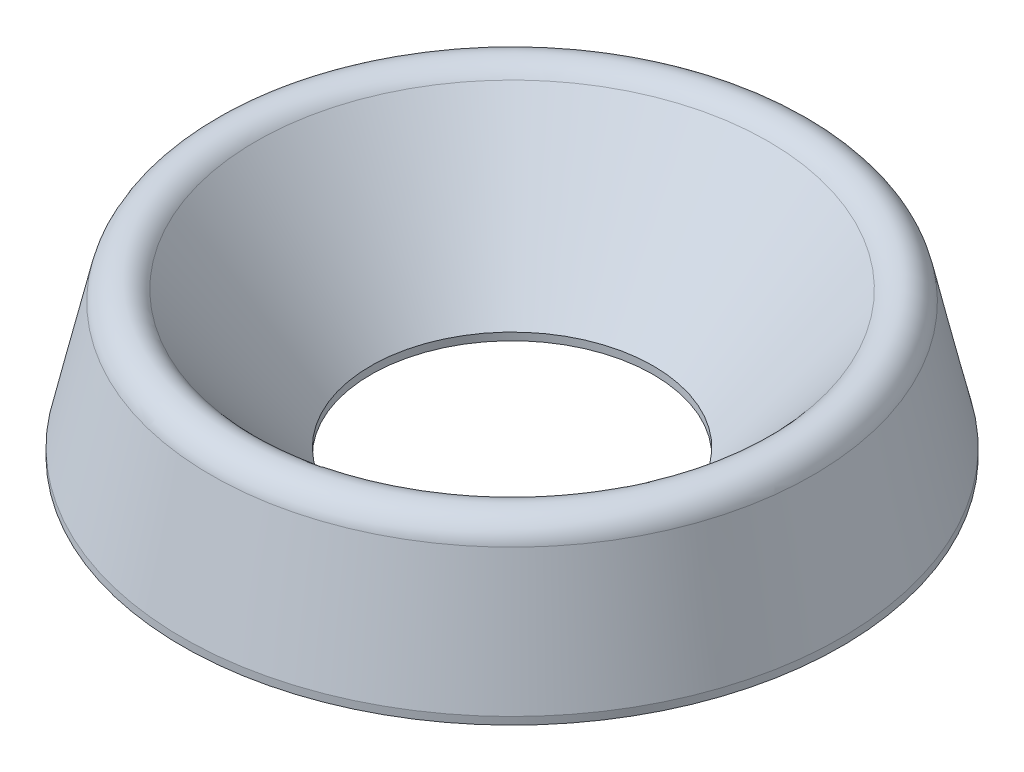
ISO-10303-21;
HEADER;
FILE_DESCRIPTION(('STEP AP214'),'2;1');
FILE_NAME('part.step','',(''),(''),'','','');
FILE_SCHEMA(('AUTOMOTIVE_DESIGN { 1 0 10303 214 1 1 1 1 }'));
ENDSEC;
DATA;
#1=APPLICATION_CONTEXT('core data for automotive mechanical design processes');
#2=APPLICATION_PROTOCOL_DEFINITION('international standard','automotive_design',2000,#1);
#3=PRODUCT_CONTEXT('',#1,'mechanical');
#4=PRODUCT('Part','Part','',(#3));
#5=PRODUCT_RELATED_PRODUCT_CATEGORY('part','',(#4));
#6=PRODUCT_DEFINITION_FORMATION('','',#4);
#7=PRODUCT_DEFINITION_CONTEXT('part definition',#1,'design');
#8=PRODUCT_DEFINITION('design','',#6,#7);
#9=PRODUCT_DEFINITION_SHAPE('','',#8);
#10=(LENGTH_UNIT() NAMED_UNIT(*) SI_UNIT(.MILLI.,.METRE.));
#11=(NAMED_UNIT(*) PLANE_ANGLE_UNIT() SI_UNIT($,.RADIAN.));
#12=(NAMED_UNIT(*) SI_UNIT($,.STERADIAN.) SOLID_ANGLE_UNIT());
#13=UNCERTAINTY_MEASURE_WITH_UNIT(LENGTH_MEASURE(1.E-05),#10,'distance_accuracy_value','');
#14=(GEOMETRIC_REPRESENTATION_CONTEXT(3) GLOBAL_UNCERTAINTY_ASSIGNED_CONTEXT((#13)) GLOBAL_UNIT_ASSIGNED_CONTEXT((#10,
#11,#12)) REPRESENTATION_CONTEXT('',''));
#15=CARTESIAN_POINT('',(0.,0.,0.));
#16=DIRECTION('',(0.,0.,1.));
#17=DIRECTION('',(1.,0.,0.));
#18=AXIS2_PLACEMENT_3D('',#15,#16,#17);
#19=CARTESIAN_POINT('',(-2.38125,0.,0.));
#20=DIRECTION('',(0.,1.,0.));
#21=DIRECTION('',(0.,0.,1.));
#22=AXIS2_PLACEMENT_3D('',#19,#20,#21);
#23=PLANE('',#22);
#24=CARTESIAN_POINT('',(0.,0.,0.));
#25=DIRECTION('',(0.,-1.,0.));
#26=DIRECTION('',(0.,0.,-1.));
#27=AXIS2_PLACEMENT_3D('',#24,#25,#26);
#28=CIRCLE('',#27,5.55625);
#29=CARTESIAN_POINT('',(0.,0.,-5.55625));
#30=VERTEX_POINT('',#29);
#31=EDGE_CURVE('E49',#30,#30,#28,.T.);
#32=ORIENTED_EDGE('',*,*,#31,.T.);
#33=EDGE_LOOP('',(#32));
#34=FACE_BOUND('',#33,.T.);
#35=CARTESIAN_POINT('',(0.,0.,0.));
#36=DIRECTION('',(0.,1.,0.));
#37=DIRECTION('',(0.,0.,1.));
#38=AXIS2_PLACEMENT_3D('',#35,#36,#37);
#39=CIRCLE('',#38,4.7625);
#40=CARTESIAN_POINT('',(0.,0.,4.7625));
#41=VERTEX_POINT('',#40);
#42=EDGE_CURVE('E64',#41,#41,#39,.F.);
#43=ORIENTED_EDGE('',*,*,#42,.F.);
#44=EDGE_LOOP('',(#43));
#45=FACE_BOUND('',#44,.T.);
#46=ADVANCED_FACE('F34',(#34,#45),#23,.F.);
#47=CARTESIAN_POINT('',(0.,2.159,0.));
#48=DIRECTION('',(0.,-1.,0.));
#49=DIRECTION('',(0.,0.,-1.));
#50=AXIS2_PLACEMENT_3D('',#47,#48,#49);
#51=TOROIDAL_SURFACE('',#50,4.64997531808592,0.4318);
#52=CARTESIAN_POINT('',(0.,2.25500545027339,0.));
#53=DIRECTION('',(0.,-1.,0.));
#54=DIRECTION('',(0.,0.,-1.));
#55=AXIS2_PLACEMENT_3D('',#52,#53,#54);
#56=CIRCLE('',#55,5.07096723430024);
#57=CARTESIAN_POINT('',(0.,2.25500545027339,-5.07096723430024));
#58=VERTEX_POINT('',#57);
#59=EDGE_CURVE('E57',#58,#58,#56,.T.);
#60=ORIENTED_EDGE('',*,*,#59,.F.);
#61=EDGE_LOOP('',(#60));
#62=FACE_BOUND('',#61,.T.);
#63=CARTESIAN_POINT('',(0.,2.43655568986265,0.));
#64=DIRECTION('',(0.,-1.,0.));
#65=DIRECTION('',(0.,0.,-1.));
#66=AXIS2_PLACEMENT_3D('',#63,#64,#65);
#67=CIRCLE('',#66,4.31919732754714);
#68=CARTESIAN_POINT('',(0.,2.43655568986265,-4.31919732754714));
#69=VERTEX_POINT('',#68);
#70=EDGE_CURVE('E10',#69,#69,#67,.T.);
#71=ORIENTED_EDGE('',*,*,#70,.T.);
#72=EDGE_LOOP('',(#71));
#73=FACE_BOUND('',#72,.T.);
#74=ADVANCED_FACE('F36',(#62,#73),#51,.T.);
#75=CARTESIAN_POINT('',(0.,0.127,0.));
#76=DIRECTION('',(0.,1.,0.));
#77=DIRECTION('',(0.,0.,1.));
#78=AXIS2_PLACEMENT_3D('',#75,#76,#77);
#79=CONICAL_SURFACE('',#78,2.38125,0.698131700797734);
#80=ORIENTED_EDGE('',*,*,#70,.F.);
#81=EDGE_LOOP('',(#80));
#82=FACE_BOUND('',#81,.T.);
#83=CARTESIAN_POINT('',(0.,0.127,0.));
#84=DIRECTION('',(0.,-1.,0.));
#85=DIRECTION('',(0.,0.,-1.));
#86=AXIS2_PLACEMENT_3D('',#83,#84,#85);
#87=CIRCLE('',#86,2.38125);
#88=CARTESIAN_POINT('',(0.,0.127,-2.38125));
#89=VERTEX_POINT('',#88);
#90=EDGE_CURVE('E41',#89,#89,#87,.T.);
#91=ORIENTED_EDGE('',*,*,#90,.T.);
#92=EDGE_LOOP('',(#91));
#93=FACE_BOUND('',#92,.T.);
#94=ADVANCED_FACE('F94',(#82,#93),#79,.F.);
#95=CARTESIAN_POINT('',(0.,0.,0.));
#96=DIRECTION('',(0.,-1.,0.));
#97=DIRECTION('',(0.,0.,-1.));
#98=AXIS2_PLACEMENT_3D('',#95,#96,#97);
#99=CYLINDRICAL_SURFACE('',#98,2.38125);
#100=ORIENTED_EDGE('',*,*,#90,.F.);
#101=EDGE_LOOP('',(#100));
#102=FACE_BOUND('',#101,.T.);
#103=CARTESIAN_POINT('',(0.,0.,0.));
#104=DIRECTION('',(0.,-1.,0.));
#105=DIRECTION('',(0.,0.,-1.));
#106=AXIS2_PLACEMENT_3D('',#103,#104,#105);
#107=CIRCLE('',#106,2.38125);
#108=CARTESIAN_POINT('',(0.,0.,-2.38125));
#109=VERTEX_POINT('',#108);
#110=EDGE_CURVE('E45',#109,#109,#107,.T.);
#111=ORIENTED_EDGE('',*,*,#110,.T.);
#112=EDGE_LOOP('',(#111));
#113=FACE_BOUND('',#112,.T.);
#114=ADVANCED_FACE('F101',(#102,#113),#99,.F.);
#115=CARTESIAN_POINT('',(0.,0.,0.));
#116=DIRECTION('',(0.,1.,0.));
#117=DIRECTION('',(0.,0.,1.));
#118=AXIS2_PLACEMENT_3D('',#115,#116,#117);
#119=CIRCLE('',#118,3.31085138274798);
#120=CARTESIAN_POINT('',(0.,0.,3.31085138274798));
#121=VERTEX_POINT('',#120);
#122=EDGE_CURVE('E60',#121,#121,#119,.F.);
#123=ORIENTED_EDGE('',*,*,#122,.T.);
#124=EDGE_LOOP('',(#123));
#125=FACE_BOUND('',#124,.T.);
#126=ORIENTED_EDGE('',*,*,#110,.F.);
#127=EDGE_LOOP('',(#126));
#128=FACE_BOUND('',#127,.T.);
#129=ADVANCED_FACE('F90',(#125,#128),#23,.F.);
#130=CARTESIAN_POINT('',(0.,0.,0.));
#131=DIRECTION('',(0.,-1.,0.));
#132=DIRECTION('',(0.,0.,-1.));
#133=AXIS2_PLACEMENT_3D('',#130,#131,#132);
#134=CYLINDRICAL_SURFACE('',#133,5.55625);
#135=ORIENTED_EDGE('',*,*,#31,.F.);
#136=EDGE_LOOP('',(#135));
#137=FACE_BOUND('',#136,.T.);
#138=CARTESIAN_POINT('',(0.,0.127,0.));
#139=DIRECTION('',(0.,-1.,0.));
#140=DIRECTION('',(0.,0.,-1.));
#141=AXIS2_PLACEMENT_3D('',#138,#139,#140);
#142=CIRCLE('',#141,5.55625);
#143=CARTESIAN_POINT('',(0.,0.127,-5.55625));
#144=VERTEX_POINT('',#143);
#145=EDGE_CURVE('E54',#144,#144,#142,.T.);
#146=ORIENTED_EDGE('',*,*,#145,.T.);
#147=EDGE_LOOP('',(#146));
#148=FACE_BOUND('',#147,.T.);
#149=ADVANCED_FACE('F100',(#137,#148),#134,.T.);
#150=CARTESIAN_POINT('',(0.,2.25500545027339,0.));
#151=DIRECTION('',(0.,-1.,0.));
#152=DIRECTION('',(0.,0.,-1.));
#153=AXIS2_PLACEMENT_3D('',#150,#151,#152);
#154=CONICAL_SURFACE('',#153,5.07096723430024,0.22421160774499);
#155=ORIENTED_EDGE('',*,*,#145,.F.);
#156=EDGE_LOOP('',(#155));
#157=FACE_BOUND('',#156,.T.);
#158=ORIENTED_EDGE('',*,*,#59,.T.);
#159=EDGE_LOOP('',(#158));
#160=FACE_BOUND('',#159,.T.);
#161=ADVANCED_FACE('F107',(#157,#160),#154,.T.);
#162=CARTESIAN_POINT('',(0.,-0.383212665188692,0.));
#163=DIRECTION('',(0.,1.,0.));
#164=DIRECTION('',(0.,0.,1.));
#165=AXIS2_PLACEMENT_3D('',#162,#163,#164);
#166=CONICAL_SURFACE('',#165,2.98929777672569,0.698131700797734);
#167=CARTESIAN_POINT('',(0.,1.36835382582079,0.));
#168=DIRECTION('',(0.,1.,0.));
#169=DIRECTION('',(0.,0.,1.));
#170=AXIS2_PLACEMENT_3D('',#167,#168,#169);
#171=CIRCLE('',#170,4.45903657331423);
#172=CARTESIAN_POINT('',(0.,1.36835382582079,4.45903657331423));
#173=VERTEX_POINT('',#172);
#174=EDGE_CURVE('E63',#173,#173,#171,.F.);
#175=ORIENTED_EDGE('',*,*,#174,.T.);
#176=EDGE_LOOP('',(#175));
#177=FACE_BOUND('',#176,.T.);
#178=ORIENTED_EDGE('',*,*,#122,.F.);
#179=EDGE_LOOP('',(#178));
#180=FACE_BOUND('',#179,.T.);
#181=ADVANCED_FACE('F73',(#177,#180),#166,.T.);
#182=CARTESIAN_POINT('',(0.,0.,0.));
#183=DIRECTION('',(0.,-1.,0.));
#184=DIRECTION('',(0.,0.,-1.));
#185=AXIS2_PLACEMENT_3D('',#182,#183,#184);
#186=CYLINDRICAL_SURFACE('',#185,4.7625);
#187=ORIENTED_EDGE('',*,*,#42,.T.);
#188=EDGE_LOOP('',(#187));
#189=FACE_BOUND('',#188,.T.);
#190=CARTESIAN_POINT('',(0.,0.0376413596264069,0.));
#191=DIRECTION('',(0.,-1.,0.));
#192=DIRECTION('',(0.,0.,-1.));
#193=AXIS2_PLACEMENT_3D('',#190,#191,#192);
#194=CIRCLE('',#193,4.7625);
#195=CARTESIAN_POINT('',(0.,0.0376413596264069,-4.7625));
#196=VERTEX_POINT('',#195);
#197=EDGE_CURVE('E67',#196,#196,#194,.T.);
#198=ORIENTED_EDGE('',*,*,#197,.F.);
#199=EDGE_LOOP('',(#198));
#200=FACE_BOUND('',#199,.T.);
#201=ADVANCED_FACE('F78',(#189,#200),#186,.F.);
#202=CARTESIAN_POINT('',(0.,2.07852484315319,0.));
#203=DIRECTION('',(0.,-1.,0.));
#204=DIRECTION('',(0.,0.,-1.));
#205=AXIS2_PLACEMENT_3D('',#202,#203,#204);
#206=CONICAL_SURFACE('',#205,4.29708503537686,0.22421160774499);
#207=ORIENTED_EDGE('',*,*,#197,.T.);
#208=EDGE_LOOP('',(#207));
#209=FACE_BOUND('',#208,.T.);
#210=ORIENTED_EDGE('',*,*,#174,.F.);
#211=EDGE_LOOP('',(#210));
#212=FACE_BOUND('',#211,.T.);
#213=ADVANCED_FACE('F76',(#209,#212),#206,.F.);
#214=CLOSED_SHELL('',(#46,#74,#94,#114,#129,#149,#161,#181,#201,#213));
#215=MANIFOLD_SOLID_BREP('B2',#214);
#216=ADVANCED_BREP_SHAPE_REPRESENTATION('',(#18,#215),#14);
#217=SHAPE_DEFINITION_REPRESENTATION(#9,#216);
ENDSEC;
END-ISO-10303-21;
